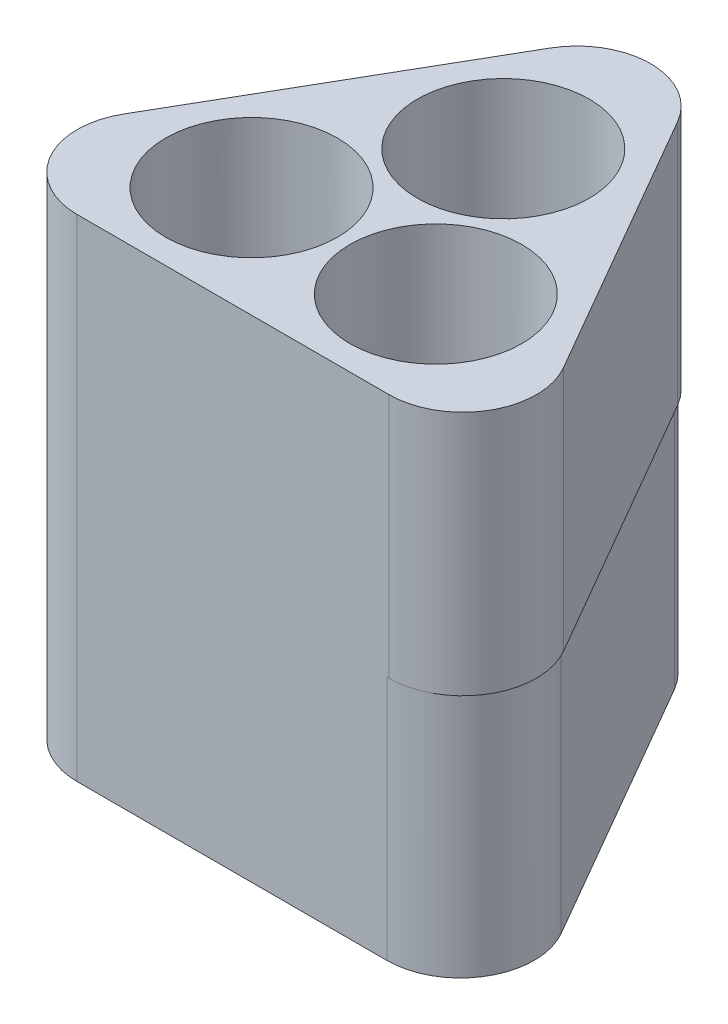
ISO-10303-21;
HEADER;
FILE_DESCRIPTION(('STEP AP214'),'2;1');
FILE_NAME('part.step','',(''),(''),'','','');
FILE_SCHEMA(('AUTOMOTIVE_DESIGN { 1 0 10303 214 1 1 1 1 }'));
ENDSEC;
DATA;
#1=APPLICATION_CONTEXT('core data for automotive mechanical design processes');
#2=APPLICATION_PROTOCOL_DEFINITION('international standard','automotive_design',2000,#1);
#3=PRODUCT_CONTEXT('',#1,'mechanical');
#4=PRODUCT('Part','Part','',(#3));
#5=PRODUCT_RELATED_PRODUCT_CATEGORY('part','',(#4));
#6=PRODUCT_DEFINITION_FORMATION('','',#4);
#7=PRODUCT_DEFINITION_CONTEXT('part definition',#1,'design');
#8=PRODUCT_DEFINITION('design','',#6,#7);
#9=PRODUCT_DEFINITION_SHAPE('','',#8);
#10=(LENGTH_UNIT() NAMED_UNIT(*) SI_UNIT(.MILLI.,.METRE.));
#11=(NAMED_UNIT(*) PLANE_ANGLE_UNIT() SI_UNIT($,.RADIAN.));
#12=(NAMED_UNIT(*) SI_UNIT($,.STERADIAN.) SOLID_ANGLE_UNIT());
#13=UNCERTAINTY_MEASURE_WITH_UNIT(LENGTH_MEASURE(1.E-05),#10,'distance_accuracy_value','');
#14=(GEOMETRIC_REPRESENTATION_CONTEXT(3) GLOBAL_UNCERTAINTY_ASSIGNED_CONTEXT((#13)) GLOBAL_UNIT_ASSIGNED_CONTEXT((#10,
#11,#12)) REPRESENTATION_CONTEXT('',''));
#15=CARTESIAN_POINT('',(0.,0.,0.));
#16=DIRECTION('',(0.,0.,1.));
#17=DIRECTION('',(1.,0.,0.));
#18=AXIS2_PLACEMENT_3D('',#15,#16,#17);
#19=CARTESIAN_POINT('',(5.19615242270666,0.,-3.));
#20=DIRECTION('',(0.,-1.,0.));
#21=DIRECTION('',(0.,0.,-1.));
#22=AXIS2_PLACEMENT_3D('',#19,#20,#21);
#23=PLANE('',#22);
#24=CARTESIAN_POINT('',(17.8978583448786,0.,-3.));
#25=DIRECTION('',(0.,1.,0.));
#26=DIRECTION('',(0.,0.,1.));
#27=AXIS2_PLACEMENT_3D('',#24,#25,#26);
#28=CIRCLE('',#27,3.);
#29=CARTESIAN_POINT('',(17.8978363700724,0.,-0.000735994244300006));
#30=VERTEX_POINT('',#29);
#31=CARTESIAN_POINT('',(20.4959345562319,0.,-4.50000000000001));
#32=VERTEX_POINT('',#31);
#33=EDGE_CURVE('E275',#30,#32,#28,.T.);
#34=ORIENTED_EDGE('',*,*,#33,.F.);
#35=CARTESIAN_POINT('',(17.8038475772933,0.,-3.));
#36=DIRECTION('',(0.,-1.,0.));
#37=DIRECTION('',(0.866025403784437,0.,-0.500000000000003));
#38=AXIS2_PLACEMENT_3D('',#35,#36,#37);
#39=CIRCLE('',#38,3.);
#40=CARTESIAN_POINT('',(20.4019237886467,0.,-4.50000000000001));
#41=VERTEX_POINT('',#40);
#42=EDGE_CURVE('E206',#41,#30,#39,.T.);
#43=ORIENTED_EDGE('',*,*,#42,.F.);
#44=DIRECTION('',(0.500000000000004,0.,0.866025403784436));
#45=VECTOR('',#44,1.);
#46=CARTESIAN_POINT('',(20.4019237886467,0.,-4.50000000000001));
#47=LINE('',#46,#45);
#48=CARTESIAN_POINT('',(14.0980762113533,0.,-15.4185842870419));
#49=VERTEX_POINT('',#48);
#50=EDGE_CURVE('E172',#49,#41,#47,.T.);
#51=ORIENTED_EDGE('',*,*,#50,.F.);
#52=CARTESIAN_POINT('',(14.0980762113533,0.,-15.4185842870419));
#53=CARTESIAN_POINT('',(13.6963534716631,0.,-16.1143884827411));
#54=CARTESIAN_POINT('',(13.,0.,-16.5166604983952));
#55=CARTESIAN_POINT('',(12.3045975270247,0.,-16.9183831376556));
#56=CARTESIAN_POINT('',(11.5,0.,-16.9185842870419));
#57=CARTESIAN_POINT('',(10.6969024729175,0.,-16.9187850614282));
#58=CARTESIAN_POINT('',(10.,0.,-16.5166604983952));
#59=CARTESIAN_POINT('',(9.34486802429678,0.,-16.1386382216831));
#60=CARTESIAN_POINT('',(8.95010615092212,0.,-15.4992732207003));
#61=B_SPLINE_CURVE_WITH_KNOTS('',2,(#52,#53,#54,#55,#56,#57,#58,#59,#60),.UNSPECIFIED.,.F.,.F.,
(3,2,2,2,3),(0.,0.25,0.5,0.75,0.985336776599091),.UNSPECIFIED.);
#62=CARTESIAN_POINT('',(8.94955558866604,0.,-15.4996129945659));
#63=VERTEX_POINT('',#62);
#64=EDGE_CURVE('E11',#49,#63,#61,.T.);
#65=ORIENTED_EDGE('',*,*,#64,.T.);
#66=CARTESIAN_POINT('',(11.5470053837926,0.,-14.));
#67=DIRECTION('',(0.,1.,0.));
#68=DIRECTION('',(0.,0.,1.));
#69=AXIS2_PLACEMENT_3D('',#66,#67,#68);
#70=CIRCLE('',#69,3.);
#71=CARTESIAN_POINT('',(14.1450815951459,0.,-15.5000000000001));
#72=VERTEX_POINT('',#71);
#73=EDGE_CURVE('E353',#72,#63,#70,.T.);
#74=ORIENTED_EDGE('',*,*,#73,.F.);
#75=DIRECTION('',(-0.500000000000004,0.,-0.866025403784436));
#76=VECTOR('',#75,1.);
#77=CARTESIAN_POINT('',(20.4959345562319,0.,-4.50000000000001));
#78=LINE('',#77,#76);
#79=EDGE_CURVE('E351',#32,#72,#78,.T.);
#80=ORIENTED_EDGE('',*,*,#79,.F.);
#81=EDGE_LOOP('',(#34,#43,#51,#65,#74,#80));
#82=FACE_BOUND('',#81,.T.);
#83=ADVANCED_FACE('F37',(#82),#23,.T.);
#84=CARTESIAN_POINT('',(7.79422863405997,0.,-4.50000000000001));
#85=DIRECTION('',(0.,1.,0.));
#86=DIRECTION('',(0.,0.,1.));
#87=AXIS2_PLACEMENT_3D('',#84,#85,#86);
#88=CIRCLE('',#87,3.5);
#89=CARTESIAN_POINT('',(7.79422863405997,0.,-1.00000000000002));
#90=VERTEX_POINT('',#89);
#91=CARTESIAN_POINT('',(4.76313972081446,0.,-6.25000000000005));
#92=VERTEX_POINT('',#91);
#93=EDGE_CURVE('E445',#90,#92,#88,.T.);
#94=ORIENTED_EDGE('',*,*,#93,.T.);
#95=DIRECTION('',(0.500000000000009,0.,-0.866025403784434));
#96=VECTOR('',#95,1.);
#97=CARTESIAN_POINT('',(8.51591647054713,0.,-12.7500000000001));
#98=LINE('',#97,#96);
#99=CARTESIAN_POINT('',(8.51591647054712,0.,-12.7500000000001));
#100=VERTEX_POINT('',#99);
#101=EDGE_CURVE('E171',#92,#100,#98,.T.);
#102=ORIENTED_EDGE('',*,*,#101,.T.);
#103=CARTESIAN_POINT('',(11.5470053837926,0.,-11.0000000000001));
#104=DIRECTION('',(0.,1.,0.));
#105=DIRECTION('',(0.,0.,1.));
#106=AXIS2_PLACEMENT_3D('',#103,#104,#105);
#107=CIRCLE('',#106,3.5);
#108=CARTESIAN_POINT('',(14.5780942970382,0.,-12.7500000000001));
#109=VERTEX_POINT('',#108);
#110=EDGE_CURVE('E333',#100,#109,#107,.T.);
#111=ORIENTED_EDGE('',*,*,#110,.T.);
#112=DIRECTION('',(0.500000000000008,0.,0.866025403784434));
#113=VECTOR('',#112,1.);
#114=CARTESIAN_POINT('',(18.3308710467708,0.,-6.25000000000005));
#115=LINE('',#114,#113);
#116=CARTESIAN_POINT('',(18.3308710467708,0.,-6.25000000000005));
#117=VERTEX_POINT('',#116);
#118=EDGE_CURVE('E190',#109,#117,#115,.T.);
#119=ORIENTED_EDGE('',*,*,#118,.T.);
#120=CARTESIAN_POINT('',(15.2997821335253,0.,-4.50000000000002));
#121=DIRECTION('',(0.,1.,0.));
#122=DIRECTION('',(0.,0.,1.));
#123=AXIS2_PLACEMENT_3D('',#120,#121,#122);
#124=CIRCLE('',#123,3.5);
#125=CARTESIAN_POINT('',(15.2997821335253,0.,-1.00000000000002));
#126=VERTEX_POINT('',#125);
#127=EDGE_CURVE('E321',#117,#126,#124,.T.);
#128=ORIENTED_EDGE('',*,*,#127,.T.);
#129=DIRECTION('',(-1.,0.,0.));
#130=VECTOR('',#129,1.);
#131=CARTESIAN_POINT('',(7.79422863405997,0.,-1.00000000000002));
#132=LINE('',#131,#130);
#133=EDGE_CURVE('E165',#126,#90,#132,.T.);
#134=ORIENTED_EDGE('',*,*,#133,.T.);
#135=EDGE_LOOP('',(#94,#102,#111,#119,#128,#134));
#136=FACE_BOUND('',#135,.T.);
#137=ADVANCED_FACE('F252',(#136),#23,.T.);
#138=CARTESIAN_POINT('',(5.19615242270666,10.,-3.));
#139=DIRECTION('',(0.,-1.,0.));
#140=DIRECTION('',(0.,0.,-1.));
#141=AXIS2_PLACEMENT_3D('',#138,#139,#140);
#142=PLANE('',#141);
#143=CARTESIAN_POINT('',(5.19615242270666,10.,-3.));
#144=DIRECTION('',(0.,1.,0.));
#145=DIRECTION('',(0.,0.,-1.));
#146=AXIS2_PLACEMENT_3D('',#143,#144,#145);
#147=CIRCLE('',#146,3.);
#148=CARTESIAN_POINT('',(2.59807621135335,10.,-4.50000000000001));
#149=VERTEX_POINT('',#148);
#150=CARTESIAN_POINT('',(5.19615242270666,10.,0.));
#151=VERTEX_POINT('',#150);
#152=EDGE_CURVE('E337',#149,#151,#147,.T.);
#153=ORIENTED_EDGE('',*,*,#152,.T.);
#154=DIRECTION('',(1.,0.,0.));
#155=VECTOR('',#154,1.);
#156=CARTESIAN_POINT('',(5.19615242270666,10.,0.));
#157=LINE('',#156,#155);
#158=CARTESIAN_POINT('',(17.8978583448786,10.,0.));
#159=VERTEX_POINT('',#158);
#160=EDGE_CURVE('E340',#151,#159,#157,.T.);
#161=ORIENTED_EDGE('',*,*,#160,.T.);
#162=CARTESIAN_POINT('',(17.8978583448786,10.,-3.));
#163=DIRECTION('',(0.,1.,0.));
#164=DIRECTION('',(0.,0.,1.));
#165=AXIS2_PLACEMENT_3D('',#162,#163,#164);
#166=CIRCLE('',#165,3.);
#167=CARTESIAN_POINT('',(20.4959345562319,10.,-4.50000000000001));
#168=VERTEX_POINT('',#167);
#169=EDGE_CURVE('E342',#159,#168,#166,.T.);
#170=ORIENTED_EDGE('',*,*,#169,.T.);
#171=DIRECTION('',(-0.500000000000004,0.,-0.866025403784436));
#172=VECTOR('',#171,1.);
#173=CARTESIAN_POINT('',(20.4959345562319,10.,-4.50000000000001));
#174=LINE('',#173,#172);
#175=CARTESIAN_POINT('',(14.1450815951459,10.,-15.5000000000001));
#176=VERTEX_POINT('',#175);
#177=EDGE_CURVE('E344',#168,#176,#174,.T.);
#178=ORIENTED_EDGE('',*,*,#177,.T.);
#179=CARTESIAN_POINT('',(11.5470053837926,10.,-14.));
#180=DIRECTION('',(0.,1.,0.));
#181=DIRECTION('',(0.,0.,1.));
#182=AXIS2_PLACEMENT_3D('',#179,#180,#181);
#183=CIRCLE('',#182,3.);
#184=CARTESIAN_POINT('',(8.94892917243933,10.,-15.5000000000001));
#185=VERTEX_POINT('',#184);
#186=EDGE_CURVE('E346',#176,#185,#183,.T.);
#187=ORIENTED_EDGE('',*,*,#186,.T.);
#188=DIRECTION('',(-0.500000000000004,0.,0.866025403784436));
#189=VECTOR('',#188,1.);
#190=CARTESIAN_POINT('',(8.94892917243933,10.,-15.5000000000001));
#191=LINE('',#190,#189);
#192=EDGE_CURVE('E348',#185,#149,#191,.T.);
#193=ORIENTED_EDGE('',*,*,#192,.T.);
#194=EDGE_LOOP('',(#153,#161,#170,#178,#187,#193));
#195=FACE_BOUND('',#194,.T.);
#196=CARTESIAN_POINT('',(15.2997821335253,10.,-4.50000000000002));
#197=DIRECTION('',(0.,1.,0.));
#198=DIRECTION('',(0.,0.,1.));
#199=AXIS2_PLACEMENT_3D('',#196,#197,#198);
#200=CIRCLE('',#199,3.5);
#201=CARTESIAN_POINT('',(15.2997821335253,10.,-1.00000000000002));
#202=VERTEX_POINT('',#201);
#203=EDGE_CURVE('E326',#202,#202,#200,.T.);
#204=ORIENTED_EDGE('',*,*,#203,.F.);
#205=EDGE_LOOP('',(#204));
#206=FACE_BOUND('',#205,.T.);
#207=CARTESIAN_POINT('',(11.5470053837926,10.,-11.0000000000001));
#208=DIRECTION('',(0.,1.,0.));
#209=DIRECTION('',(0.,0.,1.));
#210=AXIS2_PLACEMENT_3D('',#207,#208,#209);
#211=CIRCLE('',#210,3.5);
#212=CARTESIAN_POINT('',(11.5470053837926,10.,-7.50000000000006));
#213=VERTEX_POINT('',#212);
#214=EDGE_CURVE('E327',#213,#213,#211,.T.);
#215=ORIENTED_EDGE('',*,*,#214,.F.);
#216=EDGE_LOOP('',(#215));
#217=FACE_BOUND('',#216,.T.);
#218=CARTESIAN_POINT('',(7.79422863405997,10.,-4.50000000000001));
#219=DIRECTION('',(0.,1.,0.));
#220=DIRECTION('',(0.,0.,1.));
#221=AXIS2_PLACEMENT_3D('',#218,#219,#220);
#222=CIRCLE('',#221,3.5);
#223=CARTESIAN_POINT('',(7.79422863405997,10.,-1.00000000000001));
#224=VERTEX_POINT('',#223);
#225=EDGE_CURVE('E442',#224,#224,#222,.T.);
#226=ORIENTED_EDGE('',*,*,#225,.F.);
#227=EDGE_LOOP('',(#226));
#228=FACE_BOUND('',#227,.T.);
#229=ADVANCED_FACE('F250',(#195,#206,#217,#228),#142,.F.);
#230=CARTESIAN_POINT('',(5.19615242270666,10.,-3.));
#231=DIRECTION('',(0.,-1.,0.));
#232=DIRECTION('',(0.,0.,-1.));
#233=AXIS2_PLACEMENT_3D('',#230,#231,#232);
#234=CYLINDRICAL_SURFACE('',#233,3.);
#235=DIRECTION('',(0.,-1.,0.));
#236=VECTOR('',#235,1.);
#237=CARTESIAN_POINT('',(2.59807621135335,10.,-4.50000000000001));
#238=LINE('',#237,#236);
#239=CARTESIAN_POINT('',(2.59807621135335,-10.,-4.50000000000001));
#240=VERTEX_POINT('',#239);
#241=EDGE_CURVE('E350',#149,#240,#238,.T.);
#242=ORIENTED_EDGE('',*,*,#241,.T.);
#243=CARTESIAN_POINT('',(5.19615242270666,-10.,-3.));
#244=DIRECTION('',(0.,-1.,0.));
#245=DIRECTION('',(0.,0.,-1.));
#246=AXIS2_PLACEMENT_3D('',#243,#244,#245);
#247=CIRCLE('',#246,3.);
#248=CARTESIAN_POINT('',(5.19615242270666,-10.,0.));
#249=VERTEX_POINT('',#248);
#250=EDGE_CURVE('E202',#249,#240,#247,.T.);
#251=ORIENTED_EDGE('',*,*,#250,.F.);
#252=DIRECTION('',(0.,-1.,0.));
#253=VECTOR('',#252,1.);
#254=CARTESIAN_POINT('',(5.19615242270666,10.,0.));
#255=LINE('',#254,#253);
#256=EDGE_CURVE('E48',#151,#249,#255,.T.);
#257=ORIENTED_EDGE('',*,*,#256,.F.);
#258=ORIENTED_EDGE('',*,*,#152,.F.);
#259=EDGE_LOOP('',(#242,#251,#257,#258));
#260=FACE_BOUND('',#259,.T.);
#261=ADVANCED_FACE('F39',(#260),#234,.T.);
#262=CARTESIAN_POINT('',(5.19615242270666,10.,0.));
#263=DIRECTION('',(0.,0.,-1.));
#264=DIRECTION('',(-1.,0.,0.));
#265=AXIS2_PLACEMENT_3D('',#262,#263,#264);
#266=PLANE('',#265);
#267=ORIENTED_EDGE('',*,*,#256,.T.);
#268=DIRECTION('',(-1.,0.,0.));
#269=VECTOR('',#268,1.);
#270=CARTESIAN_POINT('',(5.19615242270666,-10.,0.));
#271=LINE('',#270,#269);
#272=CARTESIAN_POINT('',(17.8038475772933,-10.,0.));
#273=VERTEX_POINT('',#272);
#274=EDGE_CURVE('E214',#273,#249,#271,.T.);
#275=ORIENTED_EDGE('',*,*,#274,.F.);
#276=DIRECTION('',(0.,1.,0.));
#277=VECTOR('',#276,1.);
#278=CARTESIAN_POINT('',(17.8038475772933,-10.,0.));
#279=LINE('',#278,#277);
#280=CARTESIAN_POINT('',(17.8038475772933,0.,0.));
#281=VERTEX_POINT('',#280);
#282=EDGE_CURVE('E217',#273,#281,#279,.T.);
#283=ORIENTED_EDGE('',*,*,#282,.T.);
#284=CARTESIAN_POINT('',(17.8038475772933,0.,0.));
#285=DIRECTION('',(1.,0.,0.));
#286=VECTOR('',#285,1.);
#287=LINE('',#284,#286);
#288=EDGE_CURVE('E330',#281,#30,#287,.T.);
#289=ORIENTED_EDGE('',*,*,#288,.T.);
#290=DIRECTION('',(0.,-1.,0.));
#291=VECTOR('',#290,1.);
#292=CARTESIAN_POINT('',(17.8978583448786,10.,0.));
#293=LINE('',#292,#291);
#294=EDGE_CURVE('E361',#159,#30,#293,.T.);
#295=ORIENTED_EDGE('',*,*,#294,.F.);
#296=ORIENTED_EDGE('',*,*,#160,.F.);
#297=EDGE_LOOP('',(#267,#275,#283,#289,#295,#296));
#298=FACE_BOUND('',#297,.T.);
#299=ADVANCED_FACE('F387',(#298),#266,.F.);
#300=CARTESIAN_POINT('',(17.8978583448786,10.,-3.));
#301=DIRECTION('',(0.,-1.,0.));
#302=DIRECTION('',(0.,0.,-1.));
#303=AXIS2_PLACEMENT_3D('',#300,#301,#302);
#304=CYLINDRICAL_SURFACE('',#303,3.);
#305=ORIENTED_EDGE('',*,*,#33,.T.);
#306=DIRECTION('',(0.,-1.,0.));
#307=VECTOR('',#306,1.);
#308=CARTESIAN_POINT('',(20.4959345562319,10.,-4.50000000000001));
#309=LINE('',#308,#307);
#310=EDGE_CURVE('E357',#168,#32,#309,.T.);
#311=ORIENTED_EDGE('',*,*,#310,.F.);
#312=ORIENTED_EDGE('',*,*,#169,.F.);
#313=ORIENTED_EDGE('',*,*,#294,.T.);
#314=EDGE_LOOP('',(#305,#311,#312,#313));
#315=FACE_BOUND('',#314,.T.);
#316=ADVANCED_FACE('F396',(#315),#304,.T.);
#317=CARTESIAN_POINT('',(20.4959345562319,10.,-4.50000000000001));
#318=DIRECTION('',(-0.866025403784436,0.,0.500000000000004));
#319=DIRECTION('',(0.500000000000004,0.,0.866025403784436));
#320=AXIS2_PLACEMENT_3D('',#317,#318,#319);
#321=PLANE('',#320);
#322=ORIENTED_EDGE('',*,*,#79,.T.);
#323=DIRECTION('',(0.,-1.,0.));
#324=VECTOR('',#323,1.);
#325=CARTESIAN_POINT('',(14.1450815951459,10.,-15.5000000000001));
#326=LINE('',#325,#324);
#327=EDGE_CURVE('E354',#176,#72,#326,.T.);
#328=ORIENTED_EDGE('',*,*,#327,.F.);
#329=ORIENTED_EDGE('',*,*,#177,.F.);
#330=ORIENTED_EDGE('',*,*,#310,.T.);
#331=EDGE_LOOP('',(#322,#328,#329,#330));
#332=FACE_BOUND('',#331,.T.);
#333=ADVANCED_FACE('F400',(#332),#321,.F.);
#334=CARTESIAN_POINT('',(11.5470053837926,10.,-14.));
#335=DIRECTION('',(0.,-1.,0.));
#336=DIRECTION('',(0.,0.,-1.));
#337=AXIS2_PLACEMENT_3D('',#334,#335,#336);
#338=CYLINDRICAL_SURFACE('',#337,3.);
#339=ORIENTED_EDGE('',*,*,#73,.T.);
#340=DIRECTION('',(0.,-1.,0.));
#341=VECTOR('',#340,1.);
#342=CARTESIAN_POINT('',(8.94892917243933,10.,-15.5000000000001));
#343=LINE('',#342,#341);
#344=EDGE_CURVE('E358',#185,#63,#343,.T.);
#345=ORIENTED_EDGE('',*,*,#344,.F.);
#346=ORIENTED_EDGE('',*,*,#186,.F.);
#347=ORIENTED_EDGE('',*,*,#327,.T.);
#348=EDGE_LOOP('',(#339,#345,#346,#347));
#349=FACE_BOUND('',#348,.T.);
#350=ADVANCED_FACE('F403',(#349),#338,.T.);
#351=CARTESIAN_POINT('',(8.94892917243933,10.,-15.5000000000001));
#352=DIRECTION('',(0.866025403784436,0.,0.500000000000004));
#353=DIRECTION('',(0.500000000000004,0.,-0.866025403784436));
#354=AXIS2_PLACEMENT_3D('',#351,#352,#353);
#355=PLANE('',#354);
#356=CARTESIAN_POINT('',(8.94892917243934,0.,-15.5000000000001));
#357=DIRECTION('',(-0.500000000000008,0.,0.866025403784434));
#358=VECTOR('',#357,1.);
#359=LINE('',#356,#358);
#360=CARTESIAN_POINT('',(8.90192378864669,0.,-15.4185842870419));
#361=VERTEX_POINT('',#360);
#362=EDGE_CURVE('E219',#63,#361,#359,.T.);
#363=ORIENTED_EDGE('',*,*,#362,.T.);
#364=DIRECTION('',(0.,1.,0.));
#365=VECTOR('',#364,1.);
#366=CARTESIAN_POINT('',(8.9019237886467,-10.,-15.4185842870419));
#367=LINE('',#366,#365);
#368=CARTESIAN_POINT('',(8.9019237886467,-10.,-15.4185842870419));
#369=VERTEX_POINT('',#368);
#370=EDGE_CURVE('E63',#369,#361,#367,.T.);
#371=ORIENTED_EDGE('',*,*,#370,.F.);
#372=DIRECTION('',(0.500000000000004,0.,-0.866025403784436));
#373=VECTOR('',#372,1.);
#374=CARTESIAN_POINT('',(8.9019237886467,-10.,-15.4185842870419));
#375=LINE('',#374,#373);
#376=EDGE_CURVE('E205',#240,#369,#375,.T.);
#377=ORIENTED_EDGE('',*,*,#376,.F.);
#378=ORIENTED_EDGE('',*,*,#241,.F.);
#379=ORIENTED_EDGE('',*,*,#192,.F.);
#380=ORIENTED_EDGE('',*,*,#344,.T.);
#381=EDGE_LOOP('',(#363,#371,#377,#378,#379,#380));
#382=FACE_BOUND('',#381,.T.);
#383=ADVANCED_FACE('F248',(#382),#355,.F.);
#384=CARTESIAN_POINT('',(15.2997821335253,10.,-4.50000000000002));
#385=DIRECTION('',(0.,-1.,0.));
#386=DIRECTION('',(0.,0.,-1.));
#387=AXIS2_PLACEMENT_3D('',#384,#385,#386);
#388=CYLINDRICAL_SURFACE('',#387,3.5);
#389=ORIENTED_EDGE('',*,*,#203,.T.);
#390=EDGE_LOOP('',(#389));
#391=FACE_BOUND('',#390,.T.);
#392=ORIENTED_EDGE('',*,*,#127,.F.);
#393=DIRECTION('',(0.,1.,0.));
#394=VECTOR('',#393,1.);
#395=CARTESIAN_POINT('',(18.3308710467708,-10.,-6.25000000000005));
#396=LINE('',#395,#394);
#397=CARTESIAN_POINT('',(18.3308710467708,-10.,-6.25000000000005));
#398=VERTEX_POINT('',#397);
#399=EDGE_CURVE('E197',#398,#117,#396,.T.);
#400=ORIENTED_EDGE('',*,*,#399,.F.);
#401=CARTESIAN_POINT('',(15.2997821335253,-10.,-4.50000000000002));
#402=DIRECTION('',(0.,-1.,0.));
#403=DIRECTION('',(0.,0.,1.));
#404=AXIS2_PLACEMENT_3D('',#401,#402,#403);
#405=CIRCLE('',#404,3.5);
#406=CARTESIAN_POINT('',(15.2997821335253,-10.,-1.00000000000002));
#407=VERTEX_POINT('',#406);
#408=EDGE_CURVE('E184',#398,#407,#405,.T.);
#409=ORIENTED_EDGE('',*,*,#408,.T.);
#410=DIRECTION('',(0.,1.,0.));
#411=VECTOR('',#410,1.);
#412=CARTESIAN_POINT('',(15.2997821335253,-10.,-1.00000000000002));
#413=LINE('',#412,#411);
#414=EDGE_CURVE('E195',#407,#126,#413,.T.);
#415=ORIENTED_EDGE('',*,*,#414,.T.);
#416=EDGE_LOOP('',(#392,#400,#409,#415));
#417=FACE_BOUND('',#416,.T.);
#418=ADVANCED_FACE('F244',(#391,#417),#388,.F.);
#419=CARTESIAN_POINT('',(11.5470053837926,10.,-11.0000000000001));
#420=DIRECTION('',(0.,-1.,0.));
#421=DIRECTION('',(0.,0.,-1.));
#422=AXIS2_PLACEMENT_3D('',#419,#420,#421);
#423=CYLINDRICAL_SURFACE('',#422,3.5);
#424=ORIENTED_EDGE('',*,*,#214,.T.);
#425=EDGE_LOOP('',(#424));
#426=FACE_BOUND('',#425,.T.);
#427=ORIENTED_EDGE('',*,*,#110,.F.);
#428=DIRECTION('',(0.,1.,0.));
#429=VECTOR('',#428,1.);
#430=CARTESIAN_POINT('',(8.51591647054712,-10.,-12.7500000000001));
#431=LINE('',#430,#429);
#432=CARTESIAN_POINT('',(8.51591647054712,-10.,-12.7500000000001));
#433=VERTEX_POINT('',#432);
#434=EDGE_CURVE('E173',#433,#100,#431,.T.);
#435=ORIENTED_EDGE('',*,*,#434,.F.);
#436=CARTESIAN_POINT('',(11.5470053837926,-10.,-11.0000000000001));
#437=DIRECTION('',(0.,-1.,0.));
#438=DIRECTION('',(0.,0.,1.));
#439=AXIS2_PLACEMENT_3D('',#436,#437,#438);
#440=CIRCLE('',#439,3.5);
#441=CARTESIAN_POINT('',(14.5780942970382,-10.,-12.7500000000001));
#442=VERTEX_POINT('',#441);
#443=EDGE_CURVE('E178',#433,#442,#440,.T.);
#444=ORIENTED_EDGE('',*,*,#443,.T.);
#445=DIRECTION('',(0.,1.,0.));
#446=VECTOR('',#445,1.);
#447=CARTESIAN_POINT('',(14.5780942970382,-10.,-12.7500000000001));
#448=LINE('',#447,#446);
#449=EDGE_CURVE('E199',#442,#109,#448,.T.);
#450=ORIENTED_EDGE('',*,*,#449,.T.);
#451=EDGE_LOOP('',(#427,#435,#444,#450));
#452=FACE_BOUND('',#451,.T.);
#453=ADVANCED_FACE('F240',(#426,#452),#423,.F.);
#454=CARTESIAN_POINT('',(7.79422863405997,10.,-4.50000000000001));
#455=DIRECTION('',(0.,-1.,0.));
#456=DIRECTION('',(0.,0.,-1.));
#457=AXIS2_PLACEMENT_3D('',#454,#455,#456);
#458=CYLINDRICAL_SURFACE('',#457,3.5);
#459=ORIENTED_EDGE('',*,*,#225,.T.);
#460=EDGE_LOOP('',(#459));
#461=FACE_BOUND('',#460,.T.);
#462=ORIENTED_EDGE('',*,*,#93,.F.);
#463=DIRECTION('',(0.,1.,0.));
#464=VECTOR('',#463,1.);
#465=CARTESIAN_POINT('',(7.79422863405997,-10.,-1.00000000000002));
#466=LINE('',#465,#464);
#467=CARTESIAN_POINT('',(7.79422863405997,-10.,-1.00000000000002));
#468=VERTEX_POINT('',#467);
#469=EDGE_CURVE('E55',#468,#90,#466,.T.);
#470=ORIENTED_EDGE('',*,*,#469,.F.);
#471=CARTESIAN_POINT('',(7.79422863405997,-10.,-4.50000000000002));
#472=DIRECTION('',(0.,-1.,0.));
#473=DIRECTION('',(0.,0.,-1.));
#474=AXIS2_PLACEMENT_3D('',#471,#472,#473);
#475=CIRCLE('',#474,3.5);
#476=CARTESIAN_POINT('',(4.76313972081446,-10.,-6.25000000000005));
#477=VERTEX_POINT('',#476);
#478=EDGE_CURVE('E155',#468,#477,#475,.T.);
#479=ORIENTED_EDGE('',*,*,#478,.T.);
#480=DIRECTION('',(0.,1.,0.));
#481=VECTOR('',#480,1.);
#482=CARTESIAN_POINT('',(4.76313972081446,-10.,-6.25000000000005));
#483=LINE('',#482,#481);
#484=EDGE_CURVE('E159',#477,#92,#483,.T.);
#485=ORIENTED_EDGE('',*,*,#484,.T.);
#486=EDGE_LOOP('',(#462,#470,#479,#485));
#487=FACE_BOUND('',#486,.T.);
#488=ADVANCED_FACE('F158',(#461,#487),#458,.F.);
#489=CARTESIAN_POINT('',(5.19615242270666,-10.,-3.));
#490=DIRECTION('',(0.,-1.,0.));
#491=DIRECTION('',(0.,0.,-1.));
#492=AXIS2_PLACEMENT_3D('',#489,#490,#491);
#493=PLANE('',#492);
#494=ORIENTED_EDGE('',*,*,#250,.T.);
#495=ORIENTED_EDGE('',*,*,#376,.T.);
#496=CARTESIAN_POINT('',(11.5,-10.,-13.9185842870419));
#497=DIRECTION('',(0.,-1.,0.));
#498=DIRECTION('',(0.,0.,1.));
#499=AXIS2_PLACEMENT_3D('',#496,#497,#498);
#500=CIRCLE('',#499,3.);
#501=CARTESIAN_POINT('',(14.0980762113533,-10.,-15.4185842870419));
#502=VERTEX_POINT('',#501);
#503=EDGE_CURVE('E208',#369,#502,#500,.T.);
#504=ORIENTED_EDGE('',*,*,#503,.T.);
#505=DIRECTION('',(0.500000000000004,0.,0.866025403784436));
#506=VECTOR('',#505,1.);
#507=CARTESIAN_POINT('',(20.4019237886467,-10.,-4.50000000000001));
#508=LINE('',#507,#506);
#509=CARTESIAN_POINT('',(20.4019237886467,-10.,-4.50000000000001));
#510=VERTEX_POINT('',#509);
#511=EDGE_CURVE('E210',#502,#510,#508,.T.);
#512=ORIENTED_EDGE('',*,*,#511,.T.);
#513=CARTESIAN_POINT('',(17.8038475772933,-10.,-3.));
#514=DIRECTION('',(0.,-1.,0.));
#515=DIRECTION('',(0.,0.,1.));
#516=AXIS2_PLACEMENT_3D('',#513,#514,#515);
#517=CIRCLE('',#516,3.);
#518=EDGE_CURVE('E212',#510,#273,#517,.T.);
#519=ORIENTED_EDGE('',*,*,#518,.T.);
#520=ORIENTED_EDGE('',*,*,#274,.T.);
#521=EDGE_LOOP('',(#494,#495,#504,#512,#519,#520));
#522=FACE_BOUND('',#521,.T.);
#523=DIRECTION('',(0.500000000000009,0.,-0.866025403784434));
#524=VECTOR('',#523,1.);
#525=CARTESIAN_POINT('',(8.51591647054713,-10.,-12.7500000000001));
#526=LINE('',#525,#524);
#527=EDGE_CURVE('E164',#477,#433,#526,.T.);
#528=ORIENTED_EDGE('',*,*,#527,.F.);
#529=ORIENTED_EDGE('',*,*,#478,.F.);
#530=DIRECTION('',(-1.,0.,0.));
#531=VECTOR('',#530,1.);
#532=CARTESIAN_POINT('',(7.79422863405997,-10.,-1.00000000000002));
#533=LINE('',#532,#531);
#534=EDGE_CURVE('E187',#407,#468,#533,.T.);
#535=ORIENTED_EDGE('',*,*,#534,.F.);
#536=ORIENTED_EDGE('',*,*,#408,.F.);
#537=DIRECTION('',(0.500000000000008,0.,0.866025403784434));
#538=VECTOR('',#537,1.);
#539=CARTESIAN_POINT('',(18.3308710467708,-10.,-6.25000000000005));
#540=LINE('',#539,#538);
#541=EDGE_CURVE('E180',#442,#398,#540,.T.);
#542=ORIENTED_EDGE('',*,*,#541,.F.);
#543=ORIENTED_EDGE('',*,*,#443,.F.);
#544=EDGE_LOOP('',(#528,#529,#535,#536,#542,#543));
#545=FACE_BOUND('',#544,.T.);
#546=ADVANCED_FACE('F176',(#522,#545),#493,.T.);
#547=CARTESIAN_POINT('',(11.5,-10.,-13.9185842870419));
#548=DIRECTION('',(0.,1.,0.));
#549=DIRECTION('',(0.,0.,1.));
#550=AXIS2_PLACEMENT_3D('',#547,#548,#549);
#551=CYLINDRICAL_SURFACE('',#550,3.);
#552=ORIENTED_EDGE('',*,*,#362,.F.);
#553=ORIENTED_EDGE('',*,*,#64,.F.);
#554=DIRECTION('',(0.,1.,0.));
#555=VECTOR('',#554,1.);
#556=CARTESIAN_POINT('',(14.0980762113533,-10.,-15.4185842870419));
#557=LINE('',#556,#555);
#558=EDGE_CURVE('E450',#502,#49,#557,.T.);
#559=ORIENTED_EDGE('',*,*,#558,.F.);
#560=ORIENTED_EDGE('',*,*,#503,.F.);
#561=ORIENTED_EDGE('',*,*,#370,.T.);
#562=EDGE_LOOP('',(#552,#553,#559,#560,#561));
#563=FACE_BOUND('',#562,.T.);
#564=ADVANCED_FACE('F226',(#563),#551,.T.);
#565=CARTESIAN_POINT('',(20.4019237886467,-10.,-4.50000000000001));
#566=DIRECTION('',(-0.866025403784436,0.,0.500000000000004));
#567=DIRECTION('',(0.500000000000004,0.,0.866025403784436));
#568=AXIS2_PLACEMENT_3D('',#565,#566,#567);
#569=PLANE('',#568);
#570=ORIENTED_EDGE('',*,*,#50,.T.);
#571=DIRECTION('',(0.,1.,0.));
#572=VECTOR('',#571,1.);
#573=CARTESIAN_POINT('',(20.4019237886467,-10.,-4.50000000000001));
#574=LINE('',#573,#572);
#575=EDGE_CURVE('E293',#510,#41,#574,.T.);
#576=ORIENTED_EDGE('',*,*,#575,.F.);
#577=ORIENTED_EDGE('',*,*,#511,.F.);
#578=ORIENTED_EDGE('',*,*,#558,.T.);
#579=EDGE_LOOP('',(#570,#576,#577,#578));
#580=FACE_BOUND('',#579,.T.);
#581=ADVANCED_FACE('F236',(#580),#569,.F.);
#582=CARTESIAN_POINT('',(17.8038475772933,-10.,-3.));
#583=DIRECTION('',(0.,1.,0.));
#584=DIRECTION('',(0.,0.,1.));
#585=AXIS2_PLACEMENT_3D('',#582,#583,#584);
#586=CYLINDRICAL_SURFACE('',#585,3.);
#587=ORIENTED_EDGE('',*,*,#42,.T.);
#588=ORIENTED_EDGE('',*,*,#288,.F.);
#589=ORIENTED_EDGE('',*,*,#282,.F.);
#590=ORIENTED_EDGE('',*,*,#518,.F.);
#591=ORIENTED_EDGE('',*,*,#575,.T.);
#592=EDGE_LOOP('',(#587,#588,#589,#590,#591));
#593=FACE_BOUND('',#592,.T.);
#594=ADVANCED_FACE('F296',(#593),#586,.T.);
#595=CARTESIAN_POINT('',(8.51591647054713,-10.,-12.7500000000001));
#596=DIRECTION('',(0.866025403784434,0.,0.500000000000009));
#597=DIRECTION('',(0.500000000000009,0.,-0.866025403784434));
#598=AXIS2_PLACEMENT_3D('',#595,#596,#597);
#599=PLANE('',#598);
#600=ORIENTED_EDGE('',*,*,#101,.F.);
#601=ORIENTED_EDGE('',*,*,#484,.F.);
#602=ORIENTED_EDGE('',*,*,#527,.T.);
#603=ORIENTED_EDGE('',*,*,#434,.T.);
#604=EDGE_LOOP('',(#600,#601,#602,#603));
#605=FACE_BOUND('',#604,.T.);
#606=ADVANCED_FACE('F168',(#605),#599,.T.);
#607=CARTESIAN_POINT('',(18.3308710467708,-10.,-6.25000000000005));
#608=DIRECTION('',(-0.866025403784434,0.,0.500000000000008));
#609=DIRECTION('',(0.500000000000008,0.,0.866025403784434));
#610=AXIS2_PLACEMENT_3D('',#607,#608,#609);
#611=PLANE('',#610);
#612=ORIENTED_EDGE('',*,*,#118,.F.);
#613=ORIENTED_EDGE('',*,*,#449,.F.);
#614=ORIENTED_EDGE('',*,*,#541,.T.);
#615=ORIENTED_EDGE('',*,*,#399,.T.);
#616=EDGE_LOOP('',(#612,#613,#614,#615));
#617=FACE_BOUND('',#616,.T.);
#618=ADVANCED_FACE('F310',(#617),#611,.T.);
#619=CARTESIAN_POINT('',(7.79422863405997,-10.,-1.00000000000002));
#620=DIRECTION('',(0.,0.,-1.));
#621=DIRECTION('',(-1.,0.,0.));
#622=AXIS2_PLACEMENT_3D('',#619,#620,#621);
#623=PLANE('',#622);
#624=ORIENTED_EDGE('',*,*,#133,.F.);
#625=ORIENTED_EDGE('',*,*,#414,.F.);
#626=ORIENTED_EDGE('',*,*,#534,.T.);
#627=ORIENTED_EDGE('',*,*,#469,.T.);
#628=EDGE_LOOP('',(#624,#625,#626,#627));
#629=FACE_BOUND('',#628,.T.);
#630=ADVANCED_FACE('F313',(#629),#623,.T.);
#631=CLOSED_SHELL('',(#83,#137,#229,#261,#299,#316,#333,#350,#383,#418,#453,#488,#546,#564,#581,
#594,#606,#618,#630));
#632=MANIFOLD_SOLID_BREP('B2',#631);
#633=ADVANCED_BREP_SHAPE_REPRESENTATION('',(#18,#632),#14);
#634=SHAPE_DEFINITION_REPRESENTATION(#9,#633);
ENDSEC;
END-ISO-10303-21;
